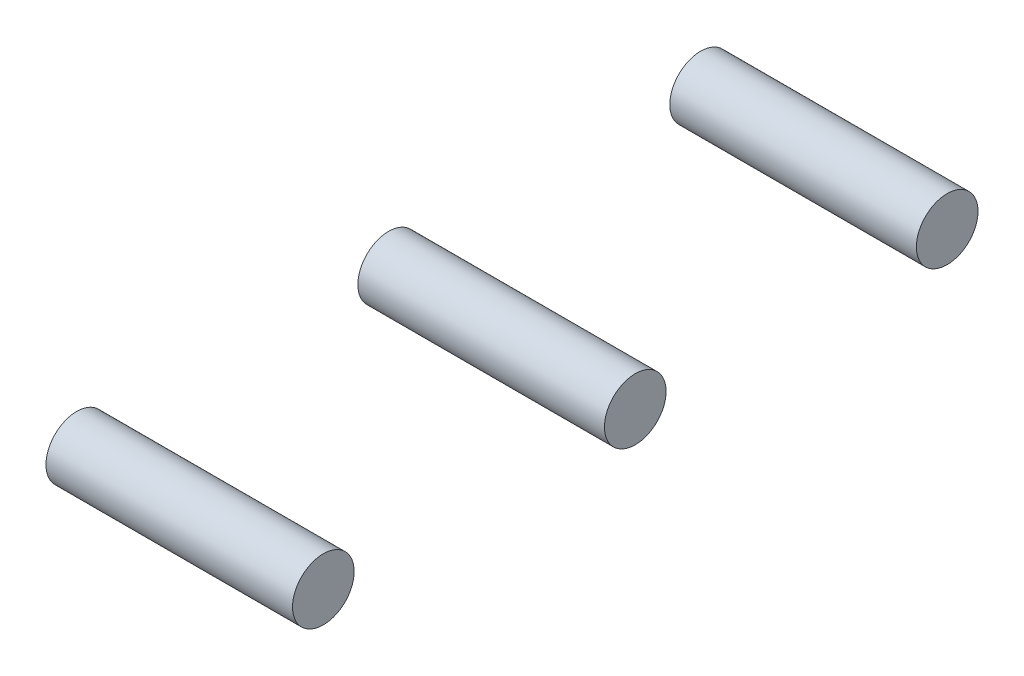
ISO-10303-21;
HEADER;
FILE_DESCRIPTION(('STEP AP214'),'2;1');
FILE_NAME('part.step','',(''),(''),'','','');
FILE_SCHEMA(('AUTOMOTIVE_DESIGN { 1 0 10303 214 1 1 1 1 }'));
ENDSEC;
DATA;
#1=APPLICATION_CONTEXT('core data for automotive mechanical design processes');
#2=APPLICATION_PROTOCOL_DEFINITION('international standard','automotive_design',2000,#1);
#3=PRODUCT_CONTEXT('',#1,'mechanical');
#4=PRODUCT('Part','Part','',(#3));
#5=PRODUCT_RELATED_PRODUCT_CATEGORY('part','',(#4));
#6=PRODUCT_DEFINITION_FORMATION('','',#4);
#7=PRODUCT_DEFINITION_CONTEXT('part definition',#1,'design');
#8=PRODUCT_DEFINITION('design','',#6,#7);
#9=PRODUCT_DEFINITION_SHAPE('','',#8);
#10=(LENGTH_UNIT() NAMED_UNIT(*) SI_UNIT(.MILLI.,.METRE.));
#11=(NAMED_UNIT(*) PLANE_ANGLE_UNIT() SI_UNIT($,.RADIAN.));
#12=(NAMED_UNIT(*) SI_UNIT($,.STERADIAN.) SOLID_ANGLE_UNIT());
#13=UNCERTAINTY_MEASURE_WITH_UNIT(LENGTH_MEASURE(1.E-05),#10,'distance_accuracy_value','');
#14=(GEOMETRIC_REPRESENTATION_CONTEXT(3) GLOBAL_UNCERTAINTY_ASSIGNED_CONTEXT((#13)) GLOBAL_UNIT_ASSIGNED_CONTEXT((#10,
#11,#12)) REPRESENTATION_CONTEXT('',''));
#15=CARTESIAN_POINT('',(0.,0.,0.));
#16=DIRECTION('',(0.,0.,1.));
#17=DIRECTION('',(1.,0.,0.));
#18=AXIS2_PLACEMENT_3D('',#15,#16,#17);
#19=CARTESIAN_POINT('',(20.,0.,-25.3));
#20=DIRECTION('',(-1.,0.,0.));
#21=DIRECTION('',(0.,0.,1.));
#22=AXIS2_PLACEMENT_3D('',#19,#20,#21);
#23=CYLINDRICAL_SURFACE('',#22,2.5);
#24=CARTESIAN_POINT('',(20.,0.,-25.3));
#25=DIRECTION('',(1.,0.,0.));
#26=DIRECTION('',(0.,0.,-1.));
#27=AXIS2_PLACEMENT_3D('',#24,#25,#26);
#28=CIRCLE('',#27,2.5);
#29=CARTESIAN_POINT('',(20.,0.,-27.8));
#30=VERTEX_POINT('',#29);
#31=EDGE_CURVE('E11',#30,#30,#28,.T.);
#32=ORIENTED_EDGE('',*,*,#31,.F.);
#33=EDGE_LOOP('',(#32));
#34=FACE_BOUND('',#33,.T.);
#35=CARTESIAN_POINT('',(0.,0.,-25.3));
#36=DIRECTION('',(1.,0.,0.));
#37=DIRECTION('',(0.,0.,-1.));
#38=AXIS2_PLACEMENT_3D('',#35,#36,#37);
#39=CIRCLE('',#38,2.5);
#40=CARTESIAN_POINT('',(0.,0.,-27.8));
#41=VERTEX_POINT('',#40);
#42=EDGE_CURVE('E43',#41,#41,#39,.T.);
#43=ORIENTED_EDGE('',*,*,#42,.T.);
#44=EDGE_LOOP('',(#43));
#45=FACE_BOUND('',#44,.T.);
#46=ADVANCED_FACE('F40',(#34,#45),#23,.T.);
#47=CARTESIAN_POINT('',(20.,0.,-25.3));
#48=DIRECTION('',(1.,0.,0.));
#49=DIRECTION('',(0.,0.,-1.));
#50=AXIS2_PLACEMENT_3D('',#47,#48,#49);
#51=PLANE('',#50);
#52=ORIENTED_EDGE('',*,*,#31,.T.);
#53=EDGE_LOOP('',(#52));
#54=FACE_BOUND('',#53,.T.);
#55=ADVANCED_FACE('F55',(#54),#51,.T.);
#56=CARTESIAN_POINT('',(0.,0.,-25.3));
#57=DIRECTION('',(1.,0.,0.));
#58=DIRECTION('',(0.,0.,-1.));
#59=AXIS2_PLACEMENT_3D('',#56,#57,#58);
#60=PLANE('',#59);
#61=ORIENTED_EDGE('',*,*,#42,.F.);
#62=EDGE_LOOP('',(#61));
#63=FACE_BOUND('',#62,.T.);
#64=ADVANCED_FACE('F53',(#63),#60,.F.);
#65=CLOSED_SHELL('',(#46,#55,#64));
#66=MANIFOLD_SOLID_BREP('B2',#65);
#67=CARTESIAN_POINT('',(20.,0.,25.3));
#68=DIRECTION('',(-1.,0.,0.));
#69=DIRECTION('',(0.,0.,1.));
#70=AXIS2_PLACEMENT_3D('',#67,#68,#69);
#71=CYLINDRICAL_SURFACE('',#70,2.5);
#72=CARTESIAN_POINT('',(20.,0.,25.3));
#73=DIRECTION('',(1.,0.,0.));
#74=DIRECTION('',(0.,0.,-1.));
#75=AXIS2_PLACEMENT_3D('',#72,#73,#74);
#76=CIRCLE('',#75,2.5);
#77=CARTESIAN_POINT('',(20.,0.,22.8));
#78=VERTEX_POINT('',#77);
#79=EDGE_CURVE('E39',#78,#78,#76,.T.);
#80=ORIENTED_EDGE('',*,*,#79,.F.);
#81=EDGE_LOOP('',(#80));
#82=FACE_BOUND('',#81,.T.);
#83=CARTESIAN_POINT('',(0.,0.,25.3));
#84=DIRECTION('',(1.,0.,0.));
#85=DIRECTION('',(0.,0.,-1.));
#86=AXIS2_PLACEMENT_3D('',#83,#84,#85);
#87=CIRCLE('',#86,2.5);
#88=CARTESIAN_POINT('',(0.,0.,22.8));
#89=VERTEX_POINT('',#88);
#90=EDGE_CURVE('E91',#89,#89,#87,.T.);
#91=ORIENTED_EDGE('',*,*,#90,.T.);
#92=EDGE_LOOP('',(#91));
#93=FACE_BOUND('',#92,.T.);
#94=ADVANCED_FACE('F88',(#82,#93),#71,.T.);
#95=CARTESIAN_POINT('',(20.,0.,25.3));
#96=DIRECTION('',(1.,0.,0.));
#97=DIRECTION('',(0.,0.,-1.));
#98=AXIS2_PLACEMENT_3D('',#95,#96,#97);
#99=PLANE('',#98);
#100=ORIENTED_EDGE('',*,*,#79,.T.);
#101=EDGE_LOOP('',(#100));
#102=FACE_BOUND('',#101,.T.);
#103=ADVANCED_FACE('F103',(#102),#99,.T.);
#104=CARTESIAN_POINT('',(0.,0.,25.3));
#105=DIRECTION('',(1.,0.,0.));
#106=DIRECTION('',(0.,0.,-1.));
#107=AXIS2_PLACEMENT_3D('',#104,#105,#106);
#108=PLANE('',#107);
#109=ORIENTED_EDGE('',*,*,#90,.F.);
#110=EDGE_LOOP('',(#109));
#111=FACE_BOUND('',#110,.T.);
#112=ADVANCED_FACE('F101',(#111),#108,.F.);
#113=CLOSED_SHELL('',(#94,#103,#112));
#114=MANIFOLD_SOLID_BREP('B6',#113);
#115=CARTESIAN_POINT('',(20.,0.,0.));
#116=DIRECTION('',(-1.,0.,0.));
#117=DIRECTION('',(0.,0.,1.));
#118=AXIS2_PLACEMENT_3D('',#115,#116,#117);
#119=CYLINDRICAL_SURFACE('',#118,2.5);
#120=CARTESIAN_POINT('',(20.,0.,0.));
#121=DIRECTION('',(1.,0.,0.));
#122=DIRECTION('',(0.,0.,-1.));
#123=AXIS2_PLACEMENT_3D('',#120,#121,#122);
#124=CIRCLE('',#123,2.5);
#125=CARTESIAN_POINT('',(20.,0.,-2.5));
#126=VERTEX_POINT('',#125);
#127=EDGE_CURVE('E87',#126,#126,#124,.T.);
#128=ORIENTED_EDGE('',*,*,#127,.F.);
#129=EDGE_LOOP('',(#128));
#130=FACE_BOUND('',#129,.T.);
#131=CARTESIAN_POINT('',(0.,0.,0.));
#132=DIRECTION('',(1.,0.,0.));
#133=DIRECTION('',(0.,0.,-1.));
#134=AXIS2_PLACEMENT_3D('',#131,#132,#133);
#135=CIRCLE('',#134,2.5);
#136=CARTESIAN_POINT('',(0.,0.,-2.5));
#137=VERTEX_POINT('',#136);
#138=EDGE_CURVE('E132',#137,#137,#135,.T.);
#139=ORIENTED_EDGE('',*,*,#138,.T.);
#140=EDGE_LOOP('',(#139));
#141=FACE_BOUND('',#140,.T.);
#142=ADVANCED_FACE('F129',(#130,#141),#119,.T.);
#143=CARTESIAN_POINT('',(20.,0.,0.));
#144=DIRECTION('',(1.,0.,0.));
#145=DIRECTION('',(0.,0.,-1.));
#146=AXIS2_PLACEMENT_3D('',#143,#144,#145);
#147=PLANE('',#146);
#148=ORIENTED_EDGE('',*,*,#127,.T.);
#149=EDGE_LOOP('',(#148));
#150=FACE_BOUND('',#149,.T.);
#151=ADVANCED_FACE('F144',(#150),#147,.T.);
#152=CARTESIAN_POINT('',(0.,0.,0.));
#153=DIRECTION('',(1.,0.,0.));
#154=DIRECTION('',(0.,0.,-1.));
#155=AXIS2_PLACEMENT_3D('',#152,#153,#154);
#156=PLANE('',#155);
#157=ORIENTED_EDGE('',*,*,#138,.F.);
#158=EDGE_LOOP('',(#157));
#159=FACE_BOUND('',#158,.T.);
#160=ADVANCED_FACE('F142',(#159),#156,.F.);
#161=CLOSED_SHELL('',(#142,#151,#160));
#162=MANIFOLD_SOLID_BREP('B34',#161);
#163=ADVANCED_BREP_SHAPE_REPRESENTATION('',(#18,#66,#114,#162),#14);
#164=SHAPE_DEFINITION_REPRESENTATION(#9,#163);
ENDSEC;
END-ISO-10303-21;
